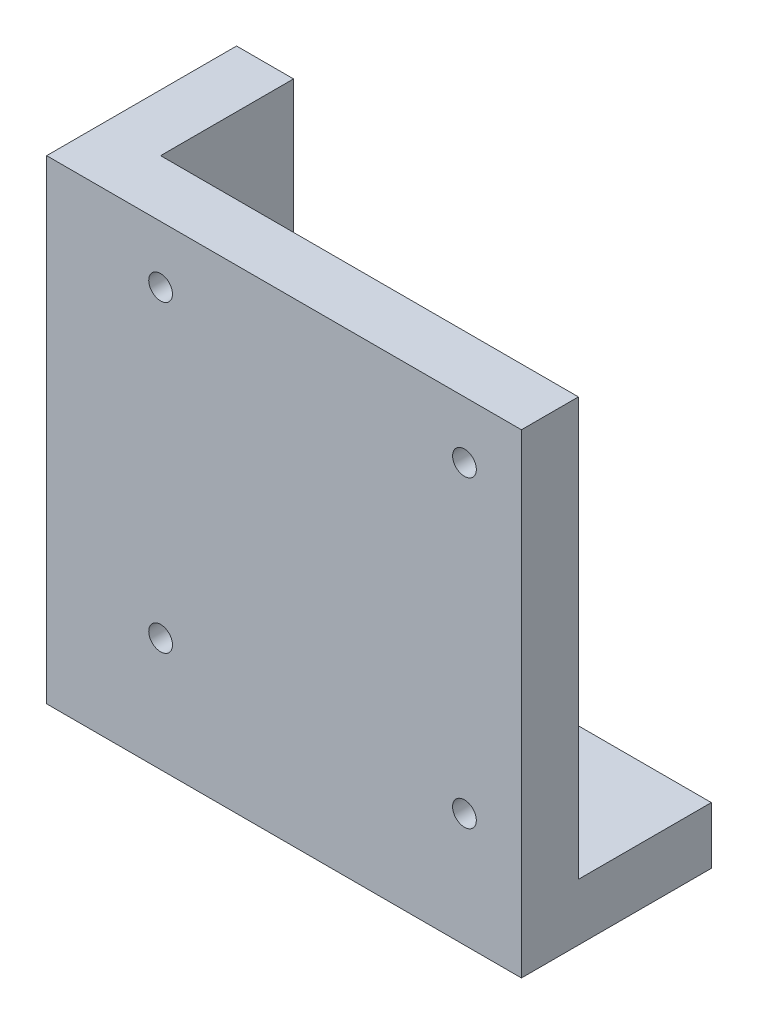
ISO-10303-21;
HEADER;
FILE_DESCRIPTION(('STEP AP214'),'2;1');
FILE_NAME('part.step','',(''),(''),'','','');
FILE_SCHEMA(('AUTOMOTIVE_DESIGN { 1 0 10303 214 1 1 1 1 }'));
ENDSEC;
DATA;
#1=APPLICATION_CONTEXT('core data for automotive mechanical design processes');
#2=APPLICATION_PROTOCOL_DEFINITION('international standard','automotive_design',2000,#1);
#3=PRODUCT_CONTEXT('',#1,'mechanical');
#4=PRODUCT('Part','Part','',(#3));
#5=PRODUCT_RELATED_PRODUCT_CATEGORY('part','',(#4));
#6=PRODUCT_DEFINITION_FORMATION('','',#4);
#7=PRODUCT_DEFINITION_CONTEXT('part definition',#1,'design');
#8=PRODUCT_DEFINITION('design','',#6,#7);
#9=PRODUCT_DEFINITION_SHAPE('','',#8);
#10=(LENGTH_UNIT() NAMED_UNIT(*) SI_UNIT(.MILLI.,.METRE.));
#11=(NAMED_UNIT(*) PLANE_ANGLE_UNIT() SI_UNIT($,.RADIAN.));
#12=(NAMED_UNIT(*) SI_UNIT($,.STERADIAN.) SOLID_ANGLE_UNIT());
#13=UNCERTAINTY_MEASURE_WITH_UNIT(LENGTH_MEASURE(1.E-05),#10,'distance_accuracy_value','');
#14=(GEOMETRIC_REPRESENTATION_CONTEXT(3) GLOBAL_UNCERTAINTY_ASSIGNED_CONTEXT((#13)) GLOBAL_UNIT_ASSIGNED_CONTEXT((#10,
#11,#12)) REPRESENTATION_CONTEXT('',''));
#15=CARTESIAN_POINT('',(0.,0.,0.));
#16=DIRECTION('',(0.,0.,1.));
#17=DIRECTION('',(1.,0.,0.));
#18=AXIS2_PLACEMENT_3D('',#15,#16,#17);
#19=CARTESIAN_POINT('',(0.,6.,0.));
#20=DIRECTION('',(0.,1.,0.));
#21=DIRECTION('',(0.,0.,1.));
#22=AXIS2_PLACEMENT_3D('',#19,#20,#21);
#23=PLANE('',#22);
#24=DIRECTION('',(0.,0.,-1.));
#25=VECTOR('',#24,1.);
#26=CARTESIAN_POINT('',(-15.3178294573643,6.,-5.62015503875969));
#27=LINE('',#26,#25);
#28=CARTESIAN_POINT('',(-15.3178294573643,6.,8.37984496124032));
#29=VERTEX_POINT('',#28);
#30=CARTESIAN_POINT('',(-15.3178294573643,6.,-5.62015503875969));
#31=VERTEX_POINT('',#30);
#32=EDGE_CURVE('E310',#29,#31,#27,.T.);
#33=ORIENTED_EDGE('',*,*,#32,.F.);
#34=DIRECTION('',(-1.,0.,0.));
#35=VECTOR('',#34,1.);
#36=CARTESIAN_POINT('',(28.6821705426357,6.,8.37984496124031));
#37=LINE('',#36,#35);
#38=CARTESIAN_POINT('',(28.6821705426357,6.,8.37984496124031));
#39=VERTEX_POINT('',#38);
#40=EDGE_CURVE('E292',#39,#29,#37,.T.);
#41=ORIENTED_EDGE('',*,*,#40,.F.);
#42=DIRECTION('',(0.,0.,-1.));
#43=VECTOR('',#42,1.);
#44=CARTESIAN_POINT('',(28.6821705426357,6.,-5.62015503875969));
#45=LINE('',#44,#43);
#46=CARTESIAN_POINT('',(28.6821705426357,6.,-5.62015503875969));
#47=VERTEX_POINT('',#46);
#48=EDGE_CURVE('E62',#39,#47,#45,.T.);
#49=ORIENTED_EDGE('',*,*,#48,.T.);
#50=DIRECTION('',(-1.,0.,0.));
#51=VECTOR('',#50,1.);
#52=CARTESIAN_POINT('',(-21.3178294573643,6.,-5.62015503875969));
#53=LINE('',#52,#51);
#54=EDGE_CURVE('E98',#47,#31,#53,.T.);
#55=ORIENTED_EDGE('',*,*,#54,.T.);
#56=EDGE_LOOP('',(#33,#41,#49,#55));
#57=FACE_BOUND('',#56,.T.);
#58=ADVANCED_FACE('F38',(#57),#23,.T.);
#59=CARTESIAN_POINT('',(-15.3178294573643,50.,-5.62015503875969));
#60=DIRECTION('',(-1.,0.,0.));
#61=DIRECTION('',(0.,0.,1.));
#62=AXIS2_PLACEMENT_3D('',#59,#60,#61);
#63=PLANE('',#62);
#64=DIRECTION('',(0.,-1.,0.));
#65=VECTOR('',#64,1.);
#66=CARTESIAN_POINT('',(-15.3178294573643,50.,8.37984496124032));
#67=LINE('',#66,#65);
#68=CARTESIAN_POINT('',(-15.3178294573643,50.,8.37984496124032));
#69=VERTEX_POINT('',#68);
#70=EDGE_CURVE('E53',#69,#29,#67,.T.);
#71=ORIENTED_EDGE('',*,*,#70,.T.);
#72=ORIENTED_EDGE('',*,*,#32,.T.);
#73=DIRECTION('',(0.,-1.,0.));
#74=VECTOR('',#73,1.);
#75=CARTESIAN_POINT('',(-15.3178294573643,50.,-5.62015503875969));
#76=LINE('',#75,#74);
#77=CARTESIAN_POINT('',(-15.3178294573643,50.,-5.62015503875969));
#78=VERTEX_POINT('',#77);
#79=EDGE_CURVE('E115',#78,#31,#76,.T.);
#80=ORIENTED_EDGE('',*,*,#79,.F.);
#81=DIRECTION('',(0.,0.,-1.));
#82=VECTOR('',#81,1.);
#83=CARTESIAN_POINT('',(-15.3178294573643,50.,-5.62015503875969));
#84=LINE('',#83,#82);
#85=EDGE_CURVE('E314',#69,#78,#84,.T.);
#86=ORIENTED_EDGE('',*,*,#85,.F.);
#87=EDGE_LOOP('',(#71,#72,#80,#86));
#88=FACE_BOUND('',#87,.T.);
#89=ADVANCED_FACE('F126',(#88),#63,.F.);
#90=CARTESIAN_POINT('',(-21.3178294573643,6.,-5.62015503875969));
#91=DIRECTION('',(1.,0.,0.));
#92=DIRECTION('',(0.,0.,-1.));
#93=AXIS2_PLACEMENT_3D('',#90,#91,#92);
#94=PLANE('',#93);
#95=DIRECTION('',(0.,0.,1.));
#96=VECTOR('',#95,1.);
#97=CARTESIAN_POINT('',(-21.3178294573643,0.,-5.62015503875969));
#98=LINE('',#97,#96);
#99=CARTESIAN_POINT('',(-21.3178294573643,0.,-5.62015503875969));
#100=VERTEX_POINT('',#99);
#101=CARTESIAN_POINT('',(-21.3178294573643,0.,14.3798449612403));
#102=VERTEX_POINT('',#101);
#103=EDGE_CURVE('E104',#100,#102,#98,.T.);
#104=ORIENTED_EDGE('',*,*,#103,.T.);
#105=DIRECTION('',(0.,-1.,0.));
#106=VECTOR('',#105,1.);
#107=CARTESIAN_POINT('',(-21.3178294573643,6.,14.3798449612403));
#108=LINE('',#107,#106);
#109=CARTESIAN_POINT('',(-21.3178294573643,50.,14.3798449612403));
#110=VERTEX_POINT('',#109);
#111=EDGE_CURVE('E11',#110,#102,#108,.T.);
#112=ORIENTED_EDGE('',*,*,#111,.F.);
#113=DIRECTION('',(0.,0.,1.));
#114=VECTOR('',#113,1.);
#115=CARTESIAN_POINT('',(-21.3178294573643,50.,-5.62015503875969));
#116=LINE('',#115,#114);
#117=CARTESIAN_POINT('',(-21.3178294573643,50.,-5.62015503875969));
#118=VERTEX_POINT('',#117);
#119=EDGE_CURVE('E311',#118,#110,#116,.T.);
#120=ORIENTED_EDGE('',*,*,#119,.F.);
#121=DIRECTION('',(0.,-1.,0.));
#122=VECTOR('',#121,1.);
#123=CARTESIAN_POINT('',(-21.3178294573643,6.,-5.62015503875969));
#124=LINE('',#123,#122);
#125=EDGE_CURVE('E99',#118,#100,#124,.T.);
#126=ORIENTED_EDGE('',*,*,#125,.T.);
#127=EDGE_LOOP('',(#104,#112,#120,#126));
#128=FACE_BOUND('',#127,.T.);
#129=ADVANCED_FACE('F40',(#128),#94,.F.);
#130=CARTESIAN_POINT('',(-21.3178294573643,6.,14.3798449612403));
#131=DIRECTION('',(0.,0.,-1.));
#132=DIRECTION('',(-1.,0.,0.));
#133=AXIS2_PLACEMENT_3D('',#130,#131,#132);
#134=PLANE('',#133);
#135=CARTESIAN_POINT('',(-9.31782945736433,44.,14.3798449612403));
#136=DIRECTION('',(0.,0.,-1.));
#137=DIRECTION('',(-1.,0.,0.));
#138=AXIS2_PLACEMENT_3D('',#135,#136,#137);
#139=CIRCLE('',#138,1.25);
#140=CARTESIAN_POINT('',(-10.5678294573643,44.,14.3798449612403));
#141=VERTEX_POINT('',#140);
#142=EDGE_CURVE('E291',#141,#141,#139,.T.);
#143=ORIENTED_EDGE('',*,*,#142,.T.);
#144=EDGE_LOOP('',(#143));
#145=FACE_BOUND('',#144,.T.);
#146=CARTESIAN_POINT('',(22.6821705426357,12.,14.3798449612403));
#147=DIRECTION('',(0.,0.,-1.));
#148=DIRECTION('',(-1.,0.,0.));
#149=AXIS2_PLACEMENT_3D('',#146,#147,#148);
#150=CIRCLE('',#149,1.25);
#151=CARTESIAN_POINT('',(21.4321705426357,12.,14.3798449612403));
#152=VERTEX_POINT('',#151);
#153=EDGE_CURVE('E293',#152,#152,#150,.T.);
#154=ORIENTED_EDGE('',*,*,#153,.T.);
#155=EDGE_LOOP('',(#154));
#156=FACE_BOUND('',#155,.T.);
#157=CARTESIAN_POINT('',(-9.31782945736434,12.,14.3798449612403));
#158=DIRECTION('',(0.,0.,-1.));
#159=DIRECTION('',(-1.,0.,0.));
#160=AXIS2_PLACEMENT_3D('',#157,#158,#159);
#161=CIRCLE('',#160,1.25);
#162=CARTESIAN_POINT('',(-10.5678294573643,12.,14.3798449612403));
#163=VERTEX_POINT('',#162);
#164=EDGE_CURVE('E298',#163,#163,#161,.T.);
#165=ORIENTED_EDGE('',*,*,#164,.T.);
#166=EDGE_LOOP('',(#165));
#167=FACE_BOUND('',#166,.T.);
#168=CARTESIAN_POINT('',(22.6821705426357,44.,14.3798449612403));
#169=DIRECTION('',(0.,0.,-1.));
#170=DIRECTION('',(-1.,0.,0.));
#171=AXIS2_PLACEMENT_3D('',#168,#169,#170);
#172=CIRCLE('',#171,1.25);
#173=CARTESIAN_POINT('',(21.4321705426357,44.,14.3798449612403));
#174=VERTEX_POINT('',#173);
#175=EDGE_CURVE('E337',#174,#174,#172,.T.);
#176=ORIENTED_EDGE('',*,*,#175,.T.);
#177=EDGE_LOOP('',(#176));
#178=FACE_BOUND('',#177,.T.);
#179=DIRECTION('',(0.,-1.,0.));
#180=VECTOR('',#179,1.);
#181=CARTESIAN_POINT('',(28.6821705426357,6.,14.3798449612403));
#182=LINE('',#181,#180);
#183=CARTESIAN_POINT('',(28.6821705426357,50.,14.3798449612403));
#184=VERTEX_POINT('',#183);
#185=CARTESIAN_POINT('',(28.6821705426357,0.,14.3798449612403));
#186=VERTEX_POINT('',#185);
#187=EDGE_CURVE('E46',#184,#186,#182,.T.);
#188=ORIENTED_EDGE('',*,*,#187,.F.);
#189=DIRECTION('',(1.,0.,0.));
#190=VECTOR('',#189,1.);
#191=CARTESIAN_POINT('',(-21.3178294573643,50.,14.3798449612403));
#192=LINE('',#191,#190);
#193=EDGE_CURVE('E123',#110,#184,#192,.T.);
#194=ORIENTED_EDGE('',*,*,#193,.F.);
#195=ORIENTED_EDGE('',*,*,#111,.T.);
#196=DIRECTION('',(1.,0.,0.));
#197=VECTOR('',#196,1.);
#198=CARTESIAN_POINT('',(-21.3178294573643,0.,14.3798449612403));
#199=LINE('',#198,#197);
#200=EDGE_CURVE('E91',#102,#186,#199,.T.);
#201=ORIENTED_EDGE('',*,*,#200,.T.);
#202=EDGE_LOOP('',(#188,#194,#195,#201));
#203=FACE_BOUND('',#202,.T.);
#204=ADVANCED_FACE('F117',(#145,#156,#167,#178,#203),#134,.F.);
#205=CARTESIAN_POINT('',(28.6821705426357,6.,-5.62015503875969));
#206=DIRECTION('',(-1.,0.,0.));
#207=DIRECTION('',(0.,0.,1.));
#208=AXIS2_PLACEMENT_3D('',#205,#206,#207);
#209=PLANE('',#208);
#210=DIRECTION('',(0.,0.,-1.));
#211=VECTOR('',#210,1.);
#212=CARTESIAN_POINT('',(28.6821705426357,0.,-5.62015503875969));
#213=LINE('',#212,#211);
#214=CARTESIAN_POINT('',(28.6821705426357,0.,-5.62015503875969));
#215=VERTEX_POINT('',#214);
#216=EDGE_CURVE('E81',#186,#215,#213,.T.);
#217=ORIENTED_EDGE('',*,*,#216,.T.);
#218=DIRECTION('',(0.,-1.,0.));
#219=VECTOR('',#218,1.);
#220=CARTESIAN_POINT('',(28.6821705426357,6.,-5.62015503875969));
#221=LINE('',#220,#219);
#222=EDGE_CURVE('E84',#47,#215,#221,.T.);
#223=ORIENTED_EDGE('',*,*,#222,.F.);
#224=ORIENTED_EDGE('',*,*,#48,.F.);
#225=DIRECTION('',(0.,-1.,0.));
#226=VECTOR('',#225,1.);
#227=CARTESIAN_POINT('',(28.6821705426357,50.,8.37984496124031));
#228=LINE('',#227,#226);
#229=CARTESIAN_POINT('',(28.6821705426357,50.,8.37984496124031));
#230=VERTEX_POINT('',#229);
#231=EDGE_CURVE('E307',#230,#39,#228,.T.);
#232=ORIENTED_EDGE('',*,*,#231,.F.);
#233=DIRECTION('',(0.,0.,-1.));
#234=VECTOR('',#233,1.);
#235=CARTESIAN_POINT('',(28.6821705426357,50.,14.3798449612403));
#236=LINE('',#235,#234);
#237=EDGE_CURVE('E295',#184,#230,#236,.T.);
#238=ORIENTED_EDGE('',*,*,#237,.F.);
#239=ORIENTED_EDGE('',*,*,#187,.T.);
#240=EDGE_LOOP('',(#217,#223,#224,#232,#238,#239));
#241=FACE_BOUND('',#240,.T.);
#242=ADVANCED_FACE('F83',(#241),#209,.F.);
#243=CARTESIAN_POINT('',(-21.3178294573643,6.,-5.62015503875969));
#244=DIRECTION('',(0.,0.,1.));
#245=DIRECTION('',(1.,0.,0.));
#246=AXIS2_PLACEMENT_3D('',#243,#244,#245);
#247=PLANE('',#246);
#248=DIRECTION('',(-1.,0.,0.));
#249=VECTOR('',#248,1.);
#250=CARTESIAN_POINT('',(-21.3178294573643,0.,-5.62015503875969));
#251=LINE('',#250,#249);
#252=EDGE_CURVE('E90',#215,#100,#251,.T.);
#253=ORIENTED_EDGE('',*,*,#252,.T.);
#254=ORIENTED_EDGE('',*,*,#125,.F.);
#255=DIRECTION('',(-1.,0.,0.));
#256=VECTOR('',#255,1.);
#257=CARTESIAN_POINT('',(-21.3178294573643,50.,-5.62015503875969));
#258=LINE('',#257,#256);
#259=EDGE_CURVE('E317',#78,#118,#258,.T.);
#260=ORIENTED_EDGE('',*,*,#259,.F.);
#261=ORIENTED_EDGE('',*,*,#79,.T.);
#262=ORIENTED_EDGE('',*,*,#54,.F.);
#263=ORIENTED_EDGE('',*,*,#222,.T.);
#264=EDGE_LOOP('',(#253,#254,#260,#261,#262,#263));
#265=FACE_BOUND('',#264,.T.);
#266=ADVANCED_FACE('F94',(#265),#247,.F.);
#267=CARTESIAN_POINT('',(0.,0.,0.));
#268=DIRECTION('',(0.,1.,0.));
#269=DIRECTION('',(0.,0.,1.));
#270=AXIS2_PLACEMENT_3D('',#267,#268,#269);
#271=PLANE('',#270);
#272=ORIENTED_EDGE('',*,*,#103,.F.);
#273=ORIENTED_EDGE('',*,*,#252,.F.);
#274=ORIENTED_EDGE('',*,*,#216,.F.);
#275=ORIENTED_EDGE('',*,*,#200,.F.);
#276=EDGE_LOOP('',(#272,#273,#274,#275));
#277=FACE_BOUND('',#276,.T.);
#278=ADVANCED_FACE('F102',(#277),#271,.F.);
#279=CARTESIAN_POINT('',(0.,50.,0.));
#280=DIRECTION('',(0.,1.,0.));
#281=DIRECTION('',(0.,0.,1.));
#282=AXIS2_PLACEMENT_3D('',#279,#280,#281);
#283=PLANE('',#282);
#284=ORIENTED_EDGE('',*,*,#119,.T.);
#285=ORIENTED_EDGE('',*,*,#193,.T.);
#286=ORIENTED_EDGE('',*,*,#237,.T.);
#287=DIRECTION('',(-1.,0.,0.));
#288=VECTOR('',#287,1.);
#289=CARTESIAN_POINT('',(28.6821705426357,50.,8.37984496124031));
#290=LINE('',#289,#288);
#291=EDGE_CURVE('E304',#230,#69,#290,.T.);
#292=ORIENTED_EDGE('',*,*,#291,.T.);
#293=ORIENTED_EDGE('',*,*,#85,.T.);
#294=ORIENTED_EDGE('',*,*,#259,.T.);
#295=EDGE_LOOP('',(#284,#285,#286,#292,#293,#294));
#296=FACE_BOUND('',#295,.T.);
#297=ADVANCED_FACE('F143',(#296),#283,.T.);
#298=CARTESIAN_POINT('',(28.6821705426357,50.,8.37984496124031));
#299=DIRECTION('',(0.,0.,1.));
#300=DIRECTION('',(1.,0.,0.));
#301=AXIS2_PLACEMENT_3D('',#298,#299,#300);
#302=PLANE('',#301);
#303=CARTESIAN_POINT('',(-9.31782945736433,44.,8.37984496124032));
#304=DIRECTION('',(0.,0.,-1.));
#305=DIRECTION('',(-1.,0.,0.));
#306=AXIS2_PLACEMENT_3D('',#303,#304,#305);
#307=CIRCLE('',#306,1.25);
#308=CARTESIAN_POINT('',(-10.5678294573643,44.,8.37984496124032));
#309=VERTEX_POINT('',#308);
#310=EDGE_CURVE('E288',#309,#309,#307,.T.);
#311=ORIENTED_EDGE('',*,*,#310,.F.);
#312=EDGE_LOOP('',(#311));
#313=FACE_BOUND('',#312,.T.);
#314=CARTESIAN_POINT('',(22.6821705426357,12.,8.37984496124031));
#315=DIRECTION('',(0.,0.,-1.));
#316=DIRECTION('',(-1.,0.,0.));
#317=AXIS2_PLACEMENT_3D('',#314,#315,#316);
#318=CIRCLE('',#317,1.25);
#319=CARTESIAN_POINT('',(21.4321705426357,12.,8.37984496124031));
#320=VERTEX_POINT('',#319);
#321=EDGE_CURVE('E343',#320,#320,#318,.T.);
#322=ORIENTED_EDGE('',*,*,#321,.F.);
#323=EDGE_LOOP('',(#322));
#324=FACE_BOUND('',#323,.T.);
#325=CARTESIAN_POINT('',(-9.31782945736434,12.,8.37984496124032));
#326=DIRECTION('',(0.,0.,-1.));
#327=DIRECTION('',(-1.,0.,0.));
#328=AXIS2_PLACEMENT_3D('',#325,#326,#327);
#329=CIRCLE('',#328,1.25);
#330=CARTESIAN_POINT('',(-10.5678294573643,12.,8.37984496124032));
#331=VERTEX_POINT('',#330);
#332=EDGE_CURVE('E346',#331,#331,#329,.T.);
#333=ORIENTED_EDGE('',*,*,#332,.F.);
#334=EDGE_LOOP('',(#333));
#335=FACE_BOUND('',#334,.T.);
#336=CARTESIAN_POINT('',(22.6821705426357,44.,8.37984496124031));
#337=DIRECTION('',(0.,0.,-1.));
#338=DIRECTION('',(-1.,0.,0.));
#339=AXIS2_PLACEMENT_3D('',#336,#337,#338);
#340=CIRCLE('',#339,1.25);
#341=CARTESIAN_POINT('',(21.4321705426357,44.,8.37984496124031));
#342=VERTEX_POINT('',#341);
#343=EDGE_CURVE('E340',#342,#342,#340,.T.);
#344=ORIENTED_EDGE('',*,*,#343,.F.);
#345=EDGE_LOOP('',(#344));
#346=FACE_BOUND('',#345,.T.);
#347=ORIENTED_EDGE('',*,*,#40,.T.);
#348=ORIENTED_EDGE('',*,*,#70,.F.);
#349=ORIENTED_EDGE('',*,*,#291,.F.);
#350=ORIENTED_EDGE('',*,*,#231,.T.);
#351=EDGE_LOOP('',(#347,#348,#349,#350));
#352=FACE_BOUND('',#351,.T.);
#353=ADVANCED_FACE('F166',(#313,#324,#335,#346,#352),#302,.F.);
#354=CARTESIAN_POINT('',(22.6821705426357,44.,52.3798449612403));
#355=DIRECTION('',(0.,0.,-1.));
#356=DIRECTION('',(-1.,0.,0.));
#357=AXIS2_PLACEMENT_3D('',#354,#355,#356);
#358=CYLINDRICAL_SURFACE('',#357,1.25);
#359=ORIENTED_EDGE('',*,*,#343,.T.);
#360=EDGE_LOOP('',(#359));
#361=FACE_BOUND('',#360,.T.);
#362=ORIENTED_EDGE('',*,*,#175,.F.);
#363=EDGE_LOOP('',(#362));
#364=FACE_BOUND('',#363,.T.);
#365=ADVANCED_FACE('F174',(#361,#364),#358,.F.);
#366=CARTESIAN_POINT('',(-9.31782945736433,12.,52.3798449612403));
#367=DIRECTION('',(0.,0.,-1.));
#368=DIRECTION('',(-1.,0.,0.));
#369=AXIS2_PLACEMENT_3D('',#366,#367,#368);
#370=CYLINDRICAL_SURFACE('',#369,1.25);
#371=ORIENTED_EDGE('',*,*,#332,.T.);
#372=EDGE_LOOP('',(#371));
#373=FACE_BOUND('',#372,.T.);
#374=ORIENTED_EDGE('',*,*,#164,.F.);
#375=EDGE_LOOP('',(#374));
#376=FACE_BOUND('',#375,.T.);
#377=ADVANCED_FACE('F185',(#373,#376),#370,.F.);
#378=CARTESIAN_POINT('',(22.6821705426357,12.,52.3798449612403));
#379=DIRECTION('',(0.,0.,-1.));
#380=DIRECTION('',(-1.,0.,0.));
#381=AXIS2_PLACEMENT_3D('',#378,#379,#380);
#382=CYLINDRICAL_SURFACE('',#381,1.25);
#383=ORIENTED_EDGE('',*,*,#321,.T.);
#384=EDGE_LOOP('',(#383));
#385=FACE_BOUND('',#384,.T.);
#386=ORIENTED_EDGE('',*,*,#153,.F.);
#387=EDGE_LOOP('',(#386));
#388=FACE_BOUND('',#387,.T.);
#389=ADVANCED_FACE('F192',(#385,#388),#382,.F.);
#390=CARTESIAN_POINT('',(-9.31782945736433,44.,52.3798449612403));
#391=DIRECTION('',(0.,0.,-1.));
#392=DIRECTION('',(-1.,0.,0.));
#393=AXIS2_PLACEMENT_3D('',#390,#391,#392);
#394=CYLINDRICAL_SURFACE('',#393,1.25);
#395=ORIENTED_EDGE('',*,*,#310,.T.);
#396=EDGE_LOOP('',(#395));
#397=FACE_BOUND('',#396,.T.);
#398=ORIENTED_EDGE('',*,*,#142,.F.);
#399=EDGE_LOOP('',(#398));
#400=FACE_BOUND('',#399,.T.);
#401=ADVANCED_FACE('F200',(#397,#400),#394,.F.);
#402=CLOSED_SHELL('',(#58,#89,#129,#204,#242,#266,#278,#297,#353,#365,#377,#389,#401));
#403=MANIFOLD_SOLID_BREP('B2',#402);
#404=ADVANCED_BREP_SHAPE_REPRESENTATION('',(#18,#403),#14);
#405=SHAPE_DEFINITION_REPRESENTATION(#9,#404);
ENDSEC;
END-ISO-10303-21;
